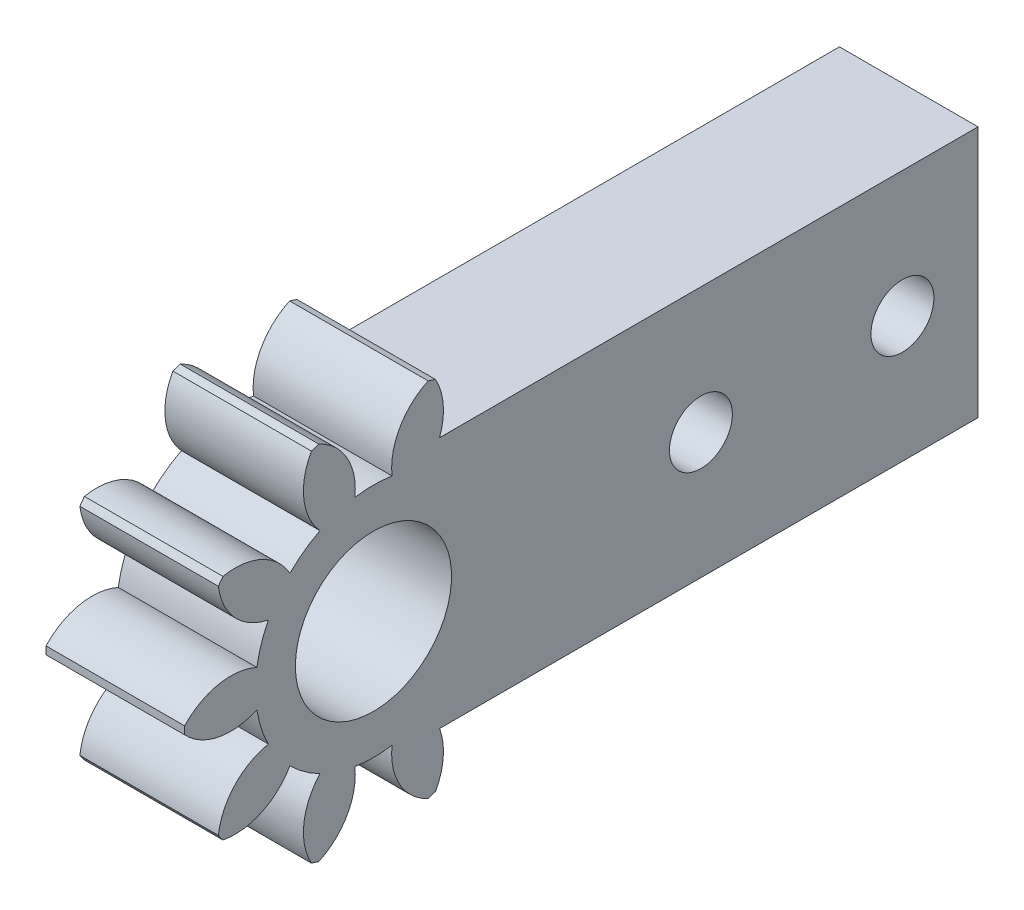
ISO-10303-21;
HEADER;
FILE_DESCRIPTION(('STEP AP214'),'2;1');
FILE_NAME('part.step','',(''),(''),'','','');
FILE_SCHEMA(('AUTOMOTIVE_DESIGN { 1 0 10303 214 1 1 1 1 }'));
ENDSEC;
DATA;
#1=APPLICATION_CONTEXT('core data for automotive mechanical design processes');
#2=APPLICATION_PROTOCOL_DEFINITION('international standard','automotive_design',2000,#1);
#3=PRODUCT_CONTEXT('',#1,'mechanical');
#4=PRODUCT('Part','Part','',(#3));
#5=PRODUCT_RELATED_PRODUCT_CATEGORY('part','',(#4));
#6=PRODUCT_DEFINITION_FORMATION('','',#4);
#7=PRODUCT_DEFINITION_CONTEXT('part definition',#1,'design');
#8=PRODUCT_DEFINITION('design','',#6,#7);
#9=PRODUCT_DEFINITION_SHAPE('','',#8);
#10=(LENGTH_UNIT() NAMED_UNIT(*) SI_UNIT(.MILLI.,.METRE.));
#11=(NAMED_UNIT(*) PLANE_ANGLE_UNIT() SI_UNIT($,.RADIAN.));
#12=(NAMED_UNIT(*) SI_UNIT($,.STERADIAN.) SOLID_ANGLE_UNIT());
#13=UNCERTAINTY_MEASURE_WITH_UNIT(LENGTH_MEASURE(1.E-05),#10,'distance_accuracy_value','');
#14=(GEOMETRIC_REPRESENTATION_CONTEXT(3) GLOBAL_UNCERTAINTY_ASSIGNED_CONTEXT((#13)) GLOBAL_UNIT_ASSIGNED_CONTEXT((#10,
#11,#12)) REPRESENTATION_CONTEXT('',''));
#15=CARTESIAN_POINT('',(0.,0.,0.));
#16=DIRECTION('',(0.,0.,1.));
#17=DIRECTION('',(1.,0.,0.));
#18=AXIS2_PLACEMENT_3D('',#15,#16,#17);
#19=CARTESIAN_POINT('',(5.5,-5.86640071722017,-0.279996722626007));
#20=DIRECTION('',(-1.,0.,0.));
#21=DIRECTION('',(0.,0.,1.));
#22=AXIS2_PLACEMENT_3D('',#19,#20,#21);
#23=CYLINDRICAL_SURFACE('',#22,2.5);
#24=CARTESIAN_POINT('',(0.,-5.86640071722017,-0.279996722626007));
#25=DIRECTION('',(-1.,0.,0.));
#26=DIRECTION('',(0.,-0.58778525229248,0.809016994374942));
#27=AXIS2_PLACEMENT_3D('',#24,#25,#26);
#28=CIRCLE('',#27,2.5);
#29=CARTESIAN_POINT('',(0.,-5.,-2.62506597473785));
#30=VERTEX_POINT('',#29);
#31=CARTESIAN_POINT('',(0.,-7.08385783572043,-2.46352555564219));
#32=VERTEX_POINT('',#31);
#33=EDGE_CURVE('E291',#30,#32,#28,.T.);
#34=ORIENTED_EDGE('',*,*,#33,.F.);
#35=DIRECTION('',(1.,0.,0.));
#36=VECTOR('',#35,1.);
#37=CARTESIAN_POINT('',(-24.0536940585425,-5.,-2.62506597473785));
#38=LINE('',#37,#36);
#39=CARTESIAN_POINT('',(5.5,-5.,-2.62506597473785));
#40=VERTEX_POINT('',#39);
#41=EDGE_CURVE('E259',#30,#40,#38,.T.);
#42=ORIENTED_EDGE('',*,*,#41,.T.);
#43=CARTESIAN_POINT('',(5.5,-5.86640071722017,-0.279996722626007));
#44=DIRECTION('',(-1.,0.,0.));
#45=DIRECTION('',(0.,-0.58778525229248,0.809016994374942));
#46=AXIS2_PLACEMENT_3D('',#43,#44,#45);
#47=CIRCLE('',#46,2.5);
#48=CARTESIAN_POINT('',(5.5,-7.08385783572044,-2.46352555564219));
#49=VERTEX_POINT('',#48);
#50=EDGE_CURVE('E295',#40,#49,#47,.T.);
#51=ORIENTED_EDGE('',*,*,#50,.T.);
#52=DIRECTION('',(-1.,0.,0.));
#53=VECTOR('',#52,1.);
#54=CARTESIAN_POINT('',(2.75,-7.08385783572044,-2.46352555564219));
#55=LINE('',#54,#53);
#56=EDGE_CURVE('E465',#49,#32,#55,.T.);
#57=ORIENTED_EDGE('',*,*,#56,.T.);
#58=EDGE_LOOP('',(#34,#42,#51,#57));
#59=FACE_BOUND('',#58,.T.);
#60=ADVANCED_FACE('F42',(#59),#23,.T.);
#61=CARTESIAN_POINT('',(5.5,0.,0.));
#62=DIRECTION('',(-1.,0.,0.));
#63=DIRECTION('',(0.,0.,1.));
#64=AXIS2_PLACEMENT_3D('',#61,#62,#63);
#65=PLANE('',#64);
#66=ORIENTED_EDGE('',*,*,#50,.F.);
#67=DIRECTION('',(0.,0.,1.));
#68=VECTOR('',#67,1.);
#69=CARTESIAN_POINT('',(5.5,-5.,0.));
#70=LINE('',#69,#68);
#71=CARTESIAN_POINT('',(5.5,-5.,-24.));
#72=VERTEX_POINT('',#71);
#73=EDGE_CURVE('E268',#72,#40,#70,.T.);
#74=ORIENTED_EDGE('',*,*,#73,.F.);
#75=DIRECTION('',(0.,1.,0.));
#76=VECTOR('',#75,1.);
#77=CARTESIAN_POINT('',(5.5,0.,-24.));
#78=LINE('',#77,#76);
#79=CARTESIAN_POINT('',(5.5,5.,-24.));
#80=VERTEX_POINT('',#79);
#81=EDGE_CURVE('E267',#72,#80,#78,.T.);
#82=ORIENTED_EDGE('',*,*,#81,.T.);
#83=DIRECTION('',(0.,0.,1.));
#84=VECTOR('',#83,1.);
#85=CARTESIAN_POINT('',(5.5,5.,0.));
#86=LINE('',#85,#84);
#87=CARTESIAN_POINT('',(5.5,5.,-2.62506597473772));
#88=VERTEX_POINT('',#87);
#89=EDGE_CURVE('E253',#80,#88,#86,.T.);
#90=ORIENTED_EDGE('',*,*,#89,.T.);
#91=CARTESIAN_POINT('',(5.5,5.86640071722017,-0.279996722625878));
#92=DIRECTION('',(-1.,0.,0.));
#93=DIRECTION('',(0.,-0.587785252292462,-0.809016994374955));
#94=AXIS2_PLACEMENT_3D('',#91,#92,#93);
#95=CIRCLE('',#94,2.5);
#96=CARTESIAN_POINT('',(5.5,7.08385783572049,-2.46352555564204));
#97=VERTEX_POINT('',#96);
#98=EDGE_CURVE('E296',#97,#88,#95,.T.);
#99=ORIENTED_EDGE('',*,*,#98,.F.);
#100=CARTESIAN_POINT('',(5.5,0.,0.));
#101=DIRECTION('',(-1.,0.,0.));
#102=DIRECTION('',(0.,0.,1.));
#103=AXIS2_PLACEMENT_3D('',#100,#101,#102);
#104=CIRCLE('',#103,7.5);
#105=CARTESIAN_POINT('',(5.5,7.17898536508605,-2.17075312458149));
#106=VERTEX_POINT('',#105);
#107=EDGE_CURVE('E332',#106,#97,#104,.T.);
#108=ORIENTED_EDGE('',*,*,#107,.F.);
#109=CARTESIAN_POINT('',(5.5,4.91059582029426,-3.22166171864632));
#110=DIRECTION('',(-1.,0.,0.));
#111=DIRECTION('',(0.,0.,-1.));
#112=AXIS2_PLACEMENT_3D('',#109,#110,#111);
#113=CIRCLE('',#112,2.5);
#114=CARTESIAN_POINT('',(5.5,4.6280790990235,-0.737676150612071));
#115=VERTEX_POINT('',#114);
#116=EDGE_CURVE('E392',#115,#106,#113,.T.);
#117=ORIENTED_EDGE('',*,*,#116,.F.);
#118=CARTESIAN_POINT('',(5.5,0.,0.));
#119=DIRECTION('',(-1.,0.,0.));
#120=DIRECTION('',(0.,0.,-1.));
#121=AXIS2_PLACEMENT_3D('',#118,#119,#120);
#122=CIRCLE('',#121,4.6865);
#123=CARTESIAN_POINT('',(5.5,4.6280790990235,0.73767615061207));
#124=VERTEX_POINT('',#123);
#125=EDGE_CURVE('E397',#124,#115,#122,.T.);
#126=ORIENTED_EDGE('',*,*,#125,.F.);
#127=CARTESIAN_POINT('',(5.5,4.91059582029426,3.22166171864632));
#128=DIRECTION('',(-1.,0.,0.));
#129=DIRECTION('',(0.,0.,-1.));
#130=AXIS2_PLACEMENT_3D('',#127,#128,#129);
#131=CIRCLE('',#130,2.5);
#132=CARTESIAN_POINT('',(5.5,7.17898536508605,2.17075312458149));
#133=VERTEX_POINT('',#132);
#134=EDGE_CURVE('E394',#133,#124,#131,.T.);
#135=ORIENTED_EDGE('',*,*,#134,.F.);
#136=CARTESIAN_POINT('',(5.5,7.08385783572045,2.46352555564214));
#137=VERTEX_POINT('',#136);
#138=EDGE_CURVE('E326',#137,#133,#104,.T.);
#139=ORIENTED_EDGE('',*,*,#138,.F.);
#140=CARTESIAN_POINT('',(5.5,5.86640071722017,0.279996722625963));
#141=DIRECTION('',(-1.,0.,0.));
#142=DIRECTION('',(0.,0.587785252292474,-0.809016994374947));
#143=AXIS2_PLACEMENT_3D('',#140,#141,#142);
#144=CIRCLE('',#143,2.5);
#145=CARTESIAN_POINT('',(5.5,4.17778980471916,2.1235240986588));
#146=VERTEX_POINT('',#145);
#147=EDGE_CURVE('E376',#146,#137,#144,.T.);
#148=ORIENTED_EDGE('',*,*,#147,.F.);
#149=CARTESIAN_POINT('',(5.5,0.,0.));
#150=DIRECTION('',(-1.,0.,0.));
#151=DIRECTION('',(0.,0.587785252292474,-0.809016994374947));
#152=AXIS2_PLACEMENT_3D('',#149,#150,#151);
#153=CIRCLE('',#152,4.6865);
#154=CARTESIAN_POINT('',(5.5,3.31059948012385,3.31710918303931));
#155=VERTEX_POINT('',#154);
#156=EDGE_CURVE('E384',#155,#146,#153,.T.);
#157=ORIENTED_EDGE('',*,*,#156,.F.);
#158=CARTESIAN_POINT('',(5.5,2.07911022502911,5.4927548836501));
#159=DIRECTION('',(-1.,0.,0.));
#160=DIRECTION('',(0.,0.587785252292474,-0.809016994374947));
#161=AXIS2_PLACEMENT_3D('',#158,#159,#160);
#162=CIRCLE('',#161,2.5);
#163=CARTESIAN_POINT('',(5.5,4.53198448972684,5.97587789240003));
#164=VERTEX_POINT('',#163);
#165=EDGE_CURVE('E471',#164,#155,#162,.T.);
#166=ORIENTED_EDGE('',*,*,#165,.F.);
#167=CARTESIAN_POINT('',(5.5,4.2829373845819,6.15682120576444));
#168=VERTEX_POINT('',#167);
#169=EDGE_CURVE('E493',#168,#164,#104,.T.);
#170=ORIENTED_EDGE('',*,*,#169,.F.);
#171=CARTESIAN_POINT('',(5.5,4.58143993179473,3.6747059325937));
#172=DIRECTION('',(-1.,0.,0.));
#173=DIRECTION('',(0.,0.951056516295155,-0.309016994374945));
#174=AXIS2_PLACEMENT_3D('',#171,#172,#173);
#175=CIRCLE('',#174,2.5);
#176=CARTESIAN_POINT('',(5.5,2.13172680286488,4.17361031817149));
#177=VERTEX_POINT('',#176);
#178=EDGE_CURVE('E421',#177,#168,#175,.T.);
#179=ORIENTED_EDGE('',*,*,#178,.F.);
#180=CARTESIAN_POINT('',(5.5,0.,0.));
#181=DIRECTION('',(-1.,0.,0.));
#182=DIRECTION('',(0.,0.951056516295155,-0.309016994374945));
#183=AXIS2_PLACEMENT_3D('',#180,#181,#182);
#184=CIRCLE('',#183,4.6865);
#185=CARTESIAN_POINT('',(5.5,0.728583382954609,4.62951925193993));
#186=VERTEX_POINT('',#185);
#187=EDGE_CURVE('E427',#186,#177,#184,.T.);
#188=ORIENTED_EDGE('',*,*,#187,.F.);
#189=CARTESIAN_POINT('',(5.5,-1.54652480983973,5.66580237497151));
#190=DIRECTION('',(-1.,0.,0.));
#191=DIRECTION('',(0.,0.951056516295155,-0.309016994374945));
#192=AXIS2_PLACEMENT_3D('',#189,#190,#191);
#193=CIRCLE('',#192,2.5);
#194=CARTESIAN_POINT('',(5.5,0.153919575779312,7.49842041794083));
#195=VERTEX_POINT('',#194);
#196=EDGE_CURVE('E526',#195,#186,#193,.T.);
#197=ORIENTED_EDGE('',*,*,#196,.F.);
#198=CARTESIAN_POINT('',(5.5,-0.153919575779365,7.49842041794083));
#199=VERTEX_POINT('',#198);
#200=EDGE_CURVE('E495',#199,#195,#104,.T.);
#201=ORIENTED_EDGE('',*,*,#200,.F.);
#202=CARTESIAN_POINT('',(5.5,1.54652480983969,5.66580237497152));
#203=DIRECTION('',(-1.,0.,0.));
#204=DIRECTION('',(0.,0.951056516295152,0.309016994374952));
#205=AXIS2_PLACEMENT_3D('',#202,#203,#204);
#206=CIRCLE('',#205,2.5);
#207=CARTESIAN_POINT('',(5.5,-0.728583382954642,4.62951925193992));
#208=VERTEX_POINT('',#207);
#209=EDGE_CURVE('E430',#208,#199,#206,.T.);
#210=ORIENTED_EDGE('',*,*,#209,.F.);
#211=CARTESIAN_POINT('',(5.5,0.,0.));
#212=DIRECTION('',(-1.,0.,0.));
#213=DIRECTION('',(0.,0.951056516295152,0.309016994374952));
#214=AXIS2_PLACEMENT_3D('',#211,#212,#213);
#215=CIRCLE('',#214,4.6865);
#216=CARTESIAN_POINT('',(5.5,-2.13172680286491,4.17361031817147));
#217=VERTEX_POINT('',#216);
#218=EDGE_CURVE('E435',#217,#208,#215,.T.);
#219=ORIENTED_EDGE('',*,*,#218,.F.);
#220=CARTESIAN_POINT('',(5.5,-4.58143993179475,3.67470593259367));
#221=DIRECTION('',(-1.,0.,0.));
#222=DIRECTION('',(0.,0.951056516295152,0.309016994374952));
#223=AXIS2_PLACEMENT_3D('',#220,#221,#222);
#224=CIRCLE('',#223,2.5);
#225=CARTESIAN_POINT('',(5.5,-4.28293738458195,6.15682120576441));
#226=VERTEX_POINT('',#225);
#227=EDGE_CURVE('E432',#226,#217,#224,.T.);
#228=ORIENTED_EDGE('',*,*,#227,.F.);
#229=CARTESIAN_POINT('',(5.5,-4.53198448972688,5.9758778924));
#230=VERTEX_POINT('',#229);
#231=EDGE_CURVE('E504',#230,#226,#104,.T.);
#232=ORIENTED_EDGE('',*,*,#231,.F.);
#233=CARTESIAN_POINT('',(5.5,-2.07911022502915,5.49275488365009));
#234=DIRECTION('',(-1.,0.,0.));
#235=DIRECTION('',(0.,0.587785252292469,0.809016994374951));
#236=AXIS2_PLACEMENT_3D('',#233,#234,#235);
#237=CIRCLE('',#236,2.5);
#238=CARTESIAN_POINT('',(5.5,-3.31059948012387,3.31710918303929));
#239=VERTEX_POINT('',#238);
#240=EDGE_CURVE('E543',#239,#230,#237,.T.);
#241=ORIENTED_EDGE('',*,*,#240,.F.);
#242=CARTESIAN_POINT('',(5.5,0.,0.));
#243=DIRECTION('',(-1.,0.,0.));
#244=DIRECTION('',(0.,0.587785252292469,0.809016994374951));
#245=AXIS2_PLACEMENT_3D('',#242,#243,#244);
#246=CIRCLE('',#245,4.6865);
#247=CARTESIAN_POINT('',(5.5,-4.17778980471917,2.12352409865877));
#248=VERTEX_POINT('',#247);
#249=EDGE_CURVE('E537',#248,#239,#246,.T.);
#250=ORIENTED_EDGE('',*,*,#249,.F.);
#251=CARTESIAN_POINT('',(5.5,-5.86640071722017,0.279996722625922));
#252=DIRECTION('',(-1.,0.,0.));
#253=DIRECTION('',(0.,0.587785252292469,0.809016994374951));
#254=AXIS2_PLACEMENT_3D('',#251,#252,#253);
#255=CIRCLE('',#254,2.5);
#256=CARTESIAN_POINT('',(5.5,-7.08385783572047,2.46352555564209));
#257=VERTEX_POINT('',#256);
#258=EDGE_CURVE('E551',#257,#248,#255,.T.);
#259=ORIENTED_EDGE('',*,*,#258,.F.);
#260=CARTESIAN_POINT('',(5.5,-7.17898536508606,2.17075312458144));
#261=VERTEX_POINT('',#260);
#262=EDGE_CURVE('E498',#261,#257,#104,.T.);
#263=ORIENTED_EDGE('',*,*,#262,.F.);
#264=CARTESIAN_POINT('',(5.5,-4.91059582029428,3.22166171864628));
#265=DIRECTION('',(-1.,0.,0.));
#266=DIRECTION('',(0.,0.,1.));
#267=AXIS2_PLACEMENT_3D('',#264,#265,#266);
#268=CIRCLE('',#267,2.5);
#269=CARTESIAN_POINT('',(5.5,-4.6280790990235,0.737676150612039));
#270=VERTEX_POINT('',#269);
#271=EDGE_CURVE('E299',#270,#261,#268,.T.);
#272=ORIENTED_EDGE('',*,*,#271,.F.);
#273=CARTESIAN_POINT('',(5.5,0.,0.));
#274=DIRECTION('',(-1.,0.,0.));
#275=DIRECTION('',(0.,0.,1.));
#276=AXIS2_PLACEMENT_3D('',#273,#274,#275);
#277=CIRCLE('',#276,4.6865);
#278=CARTESIAN_POINT('',(5.5,-4.62807909902349,-0.737676150612103));
#279=VERTEX_POINT('',#278);
#280=EDGE_CURVE('E304',#279,#270,#277,.T.);
#281=ORIENTED_EDGE('',*,*,#280,.F.);
#282=CARTESIAN_POINT('',(5.5,-4.91059582029424,-3.22166171864635));
#283=DIRECTION('',(-1.,0.,0.));
#284=DIRECTION('',(0.,0.,1.));
#285=AXIS2_PLACEMENT_3D('',#282,#283,#284);
#286=CIRCLE('',#285,2.5);
#287=CARTESIAN_POINT('',(5.5,-7.17898536508604,-2.17075312458154));
#288=VERTEX_POINT('',#287);
#289=EDGE_CURVE('E301',#288,#279,#286,.T.);
#290=ORIENTED_EDGE('',*,*,#289,.F.);
#291=EDGE_CURVE('E494',#49,#288,#104,.T.);
#292=ORIENTED_EDGE('',*,*,#291,.F.);
#293=EDGE_LOOP('',(#66,#74,#82,#90,#99,#108,#117,#126,#135,#139,#148,#157,#166,#170,#179,#188,
#197,#201,#210,#219,#228,#232,#241,#250,#259,#263,#272,#281,#290,#292));
#294=FACE_BOUND('',#293,.T.);
#295=CARTESIAN_POINT('',(5.5,0.,0.));
#296=DIRECTION('',(-1.,0.,0.));
#297=DIRECTION('',(0.,0.,1.));
#298=AXIS2_PLACEMENT_3D('',#295,#296,#297);
#299=CIRCLE('',#298,3.1);
#300=CARTESIAN_POINT('',(5.5,0.,3.1));
#301=VERTEX_POINT('',#300);
#302=EDGE_CURVE('E283',#301,#301,#299,.F.);
#303=ORIENTED_EDGE('',*,*,#302,.F.);
#304=EDGE_LOOP('',(#303));
#305=FACE_BOUND('',#304,.T.);
#306=CARTESIAN_POINT('',(5.5,0.,-21.));
#307=DIRECTION('',(1.,0.,0.));
#308=DIRECTION('',(0.,0.,-1.));
#309=AXIS2_PLACEMENT_3D('',#306,#307,#308);
#310=CIRCLE('',#309,1.25);
#311=CARTESIAN_POINT('',(5.5,0.,-22.25));
#312=VERTEX_POINT('',#311);
#313=EDGE_CURVE('E279',#312,#312,#310,.T.);
#314=ORIENTED_EDGE('',*,*,#313,.F.);
#315=EDGE_LOOP('',(#314));
#316=FACE_BOUND('',#315,.T.);
#317=CARTESIAN_POINT('',(5.5,0.,-13.));
#318=DIRECTION('',(1.,0.,0.));
#319=DIRECTION('',(0.,0.,-1.));
#320=AXIS2_PLACEMENT_3D('',#317,#318,#319);
#321=CIRCLE('',#320,1.25);
#322=CARTESIAN_POINT('',(5.5,0.,-14.25));
#323=VERTEX_POINT('',#322);
#324=EDGE_CURVE('E594',#323,#323,#321,.T.);
#325=ORIENTED_EDGE('',*,*,#324,.F.);
#326=EDGE_LOOP('',(#325));
#327=FACE_BOUND('',#326,.T.);
#328=ADVANCED_FACE('F44',(#294,#305,#316,#327),#65,.F.);
#329=CARTESIAN_POINT('',(-10.,0.,0.));
#330=DIRECTION('',(-1.,0.,0.));
#331=DIRECTION('',(0.,0.,1.));
#332=AXIS2_PLACEMENT_3D('',#329,#330,#331);
#333=CYLINDRICAL_SURFACE('',#332,7.5);
#334=DIRECTION('',(-1.,0.,0.));
#335=VECTOR('',#334,1.);
#336=CARTESIAN_POINT('',(2.75,7.08385783572049,-2.46352555564204));
#337=LINE('',#336,#335);
#338=CARTESIAN_POINT('',(0.,7.08385783572049,-2.46352555564204));
#339=VERTEX_POINT('',#338);
#340=EDGE_CURVE('E468',#339,#97,#337,.F.);
#341=ORIENTED_EDGE('',*,*,#340,.F.);
#342=CARTESIAN_POINT('',(0.,0.,0.));
#343=DIRECTION('',(-1.,0.,0.));
#344=DIRECTION('',(0.,0.,1.));
#345=AXIS2_PLACEMENT_3D('',#342,#343,#344);
#346=CIRCLE('',#345,7.5);
#347=CARTESIAN_POINT('',(0.,7.17898536508605,-2.17075312458149));
#348=VERTEX_POINT('',#347);
#349=EDGE_CURVE('E320',#348,#339,#346,.T.);
#350=ORIENTED_EDGE('',*,*,#349,.F.);
#351=DIRECTION('',(-1.,0.,0.));
#352=VECTOR('',#351,1.);
#353=CARTESIAN_POINT('',(2.75,7.17898536508605,-2.17075312458149));
#354=LINE('',#353,#352);
#355=EDGE_CURVE('E330',#106,#348,#354,.T.);
#356=ORIENTED_EDGE('',*,*,#355,.F.);
#357=ORIENTED_EDGE('',*,*,#107,.T.);
#358=EDGE_LOOP('',(#341,#350,#356,#357));
#359=FACE_BOUND('',#358,.T.);
#360=ADVANCED_FACE('F616',(#359),#333,.T.);
#361=ORIENTED_EDGE('',*,*,#56,.F.);
#362=ORIENTED_EDGE('',*,*,#291,.T.);
#363=DIRECTION('',(-1.,0.,0.));
#364=VECTOR('',#363,1.);
#365=CARTESIAN_POINT('',(2.75,-7.17898536508604,-2.17075312458154));
#366=LINE('',#365,#364);
#367=CARTESIAN_POINT('',(0.,-7.17898536508603,-2.17075312458154));
#368=VERTEX_POINT('',#367);
#369=EDGE_CURVE('E453',#368,#288,#366,.F.);
#370=ORIENTED_EDGE('',*,*,#369,.F.);
#371=EDGE_CURVE('E327',#32,#368,#346,.T.);
#372=ORIENTED_EDGE('',*,*,#371,.F.);
#373=EDGE_LOOP('',(#361,#362,#370,#372));
#374=FACE_BOUND('',#373,.T.);
#375=ADVANCED_FACE('F733',(#374),#333,.T.);
#376=DIRECTION('',(-1.,0.,0.));
#377=VECTOR('',#376,1.);
#378=CARTESIAN_POINT('',(2.75,4.2829373845819,6.15682120576444));
#379=LINE('',#378,#377);
#380=CARTESIAN_POINT('',(0.,4.2829373845819,6.15682120576444));
#381=VERTEX_POINT('',#380);
#382=EDGE_CURVE('E463',#168,#381,#379,.T.);
#383=ORIENTED_EDGE('',*,*,#382,.F.);
#384=ORIENTED_EDGE('',*,*,#169,.T.);
#385=DIRECTION('',(-1.,0.,0.));
#386=VECTOR('',#385,1.);
#387=CARTESIAN_POINT('',(2.75,4.53198448972684,5.97587789240003));
#388=LINE('',#387,#386);
#389=CARTESIAN_POINT('',(0.,4.53198448972684,5.97587789240002));
#390=VERTEX_POINT('',#389);
#391=EDGE_CURVE('E386',#390,#164,#388,.F.);
#392=ORIENTED_EDGE('',*,*,#391,.F.);
#393=EDGE_CURVE('E328',#381,#390,#346,.T.);
#394=ORIENTED_EDGE('',*,*,#393,.F.);
#395=EDGE_LOOP('',(#383,#384,#392,#394));
#396=FACE_BOUND('',#395,.T.);
#397=ADVANCED_FACE('F642',(#396),#333,.T.);
#398=DIRECTION('',(-1.,0.,0.));
#399=VECTOR('',#398,1.);
#400=CARTESIAN_POINT('',(2.75,0.153919575779311,7.49842041794083));
#401=LINE('',#400,#399);
#402=CARTESIAN_POINT('',(0.,0.153919575779314,7.49842041794083));
#403=VERTEX_POINT('',#402);
#404=EDGE_CURVE('E461',#403,#195,#401,.F.);
#405=ORIENTED_EDGE('',*,*,#404,.F.);
#406=CARTESIAN_POINT('',(0.,-0.153919575779368,7.49842041794082));
#407=VERTEX_POINT('',#406);
#408=EDGE_CURVE('E579',#407,#403,#346,.T.);
#409=ORIENTED_EDGE('',*,*,#408,.F.);
#410=DIRECTION('',(-1.,0.,0.));
#411=VECTOR('',#410,1.);
#412=CARTESIAN_POINT('',(2.75,-0.153919575779365,7.49842041794083));
#413=LINE('',#412,#411);
#414=EDGE_CURVE('E459',#199,#407,#413,.T.);
#415=ORIENTED_EDGE('',*,*,#414,.F.);
#416=ORIENTED_EDGE('',*,*,#200,.T.);
#417=EDGE_LOOP('',(#405,#409,#415,#416));
#418=FACE_BOUND('',#417,.T.);
#419=ADVANCED_FACE('F519',(#418),#333,.T.);
#420=DIRECTION('',(-1.,0.,0.));
#421=VECTOR('',#420,1.);
#422=CARTESIAN_POINT('',(2.75,-4.28293738458195,6.15682120576441));
#423=LINE('',#422,#421);
#424=CARTESIAN_POINT('',(0.,-4.28293738458194,6.15682120576441));
#425=VERTEX_POINT('',#424);
#426=EDGE_CURVE('E457',#425,#226,#423,.F.);
#427=ORIENTED_EDGE('',*,*,#426,.F.);
#428=CARTESIAN_POINT('',(0.,-4.53198448972688,5.97587789239999));
#429=VERTEX_POINT('',#428);
#430=EDGE_CURVE('E575',#429,#425,#346,.T.);
#431=ORIENTED_EDGE('',*,*,#430,.F.);
#432=DIRECTION('',(-1.,0.,0.));
#433=VECTOR('',#432,1.);
#434=CARTESIAN_POINT('',(2.75,-4.53198448972688,5.9758778924));
#435=LINE('',#434,#433);
#436=EDGE_CURVE('E451',#230,#429,#435,.T.);
#437=ORIENTED_EDGE('',*,*,#436,.F.);
#438=ORIENTED_EDGE('',*,*,#231,.T.);
#439=EDGE_LOOP('',(#427,#431,#437,#438));
#440=FACE_BOUND('',#439,.T.);
#441=ADVANCED_FACE('F702',(#440),#333,.T.);
#442=DIRECTION('',(-1.,0.,0.));
#443=VECTOR('',#442,1.);
#444=CARTESIAN_POINT('',(2.75,-7.17898536508606,2.17075312458144));
#445=LINE('',#444,#443);
#446=CARTESIAN_POINT('',(0.,-7.17898536508606,2.17075312458144));
#447=VERTEX_POINT('',#446);
#448=EDGE_CURVE('E455',#261,#447,#445,.T.);
#449=ORIENTED_EDGE('',*,*,#448,.F.);
#450=ORIENTED_EDGE('',*,*,#262,.T.);
#451=DIRECTION('',(-1.,0.,0.));
#452=VECTOR('',#451,1.);
#453=CARTESIAN_POINT('',(2.75,-7.08385783572047,2.46352555564209));
#454=LINE('',#453,#452);
#455=CARTESIAN_POINT('',(0.,-7.08385783572047,2.46352555564209));
#456=VERTEX_POINT('',#455);
#457=EDGE_CURVE('E429',#456,#257,#454,.F.);
#458=ORIENTED_EDGE('',*,*,#457,.F.);
#459=EDGE_CURVE('E573',#447,#456,#346,.T.);
#460=ORIENTED_EDGE('',*,*,#459,.F.);
#461=EDGE_LOOP('',(#449,#450,#458,#460));
#462=FACE_BOUND('',#461,.T.);
#463=ADVANCED_FACE('F728',(#462),#333,.T.);
#464=CARTESIAN_POINT('',(0.,0.,0.));
#465=DIRECTION('',(1.,0.,0.));
#466=DIRECTION('',(0.,0.,-1.));
#467=AXIS2_PLACEMENT_3D('',#464,#465,#466);
#468=PLANE('',#467);
#469=DIRECTION('',(0.,0.,-1.));
#470=VECTOR('',#469,1.);
#471=CARTESIAN_POINT('',(0.,-5.,0.));
#472=LINE('',#471,#470);
#473=CARTESIAN_POINT('',(0.,-5.,-24.));
#474=VERTEX_POINT('',#473);
#475=EDGE_CURVE('E245',#30,#474,#472,.T.);
#476=ORIENTED_EDGE('',*,*,#475,.F.);
#477=ORIENTED_EDGE('',*,*,#33,.T.);
#478=ORIENTED_EDGE('',*,*,#371,.T.);
#479=CARTESIAN_POINT('',(0.,-4.91059582029424,-3.22166171864635));
#480=DIRECTION('',(1.,0.,0.));
#481=DIRECTION('',(0.,0.,-1.));
#482=AXIS2_PLACEMENT_3D('',#479,#480,#481);
#483=CIRCLE('',#482,2.5);
#484=CARTESIAN_POINT('',(0.,-4.62807909902349,-0.737676150612103));
#485=VERTEX_POINT('',#484);
#486=EDGE_CURVE('E568',#485,#368,#483,.T.);
#487=ORIENTED_EDGE('',*,*,#486,.F.);
#488=CARTESIAN_POINT('',(0.,0.,0.));
#489=DIRECTION('',(-1.,0.,0.));
#490=DIRECTION('',(0.,0.,1.));
#491=AXIS2_PLACEMENT_3D('',#488,#489,#490);
#492=CIRCLE('',#491,4.6865);
#493=CARTESIAN_POINT('',(0.,-4.6280790990235,0.737676150612039));
#494=VERTEX_POINT('',#493);
#495=EDGE_CURVE('E302',#485,#494,#492,.T.);
#496=ORIENTED_EDGE('',*,*,#495,.T.);
#497=CARTESIAN_POINT('',(0.,-4.91059582029428,3.22166171864628));
#498=DIRECTION('',(-1.,0.,0.));
#499=DIRECTION('',(0.,0.,1.));
#500=AXIS2_PLACEMENT_3D('',#497,#498,#499);
#501=CIRCLE('',#500,2.5);
#502=EDGE_CURVE('E307',#494,#447,#501,.T.);
#503=ORIENTED_EDGE('',*,*,#502,.T.);
#504=ORIENTED_EDGE('',*,*,#459,.T.);
#505=CARTESIAN_POINT('',(0.,-5.86640071722017,0.279996722625922));
#506=DIRECTION('',(1.,0.,0.));
#507=DIRECTION('',(0.,0.,-1.));
#508=AXIS2_PLACEMENT_3D('',#505,#506,#507);
#509=CIRCLE('',#508,2.5);
#510=CARTESIAN_POINT('',(0.,-4.17778980471917,2.12352409865877));
#511=VERTEX_POINT('',#510);
#512=EDGE_CURVE('E367',#511,#456,#509,.T.);
#513=ORIENTED_EDGE('',*,*,#512,.F.);
#514=CARTESIAN_POINT('',(0.,0.,0.));
#515=DIRECTION('',(-1.,0.,0.));
#516=DIRECTION('',(0.,0.587785252292469,0.809016994374951));
#517=AXIS2_PLACEMENT_3D('',#514,#515,#516);
#518=CIRCLE('',#517,4.6865);
#519=CARTESIAN_POINT('',(0.,-3.31059948012387,3.31710918303929));
#520=VERTEX_POINT('',#519);
#521=EDGE_CURVE('E538',#511,#520,#518,.T.);
#522=ORIENTED_EDGE('',*,*,#521,.T.);
#523=CARTESIAN_POINT('',(0.,-2.07911022502915,5.49275488365009));
#524=DIRECTION('',(-1.,0.,0.));
#525=DIRECTION('',(0.,0.587785252292469,0.809016994374951));
#526=AXIS2_PLACEMENT_3D('',#523,#524,#525);
#527=CIRCLE('',#526,2.5);
#528=EDGE_CURVE('E544',#520,#429,#527,.T.);
#529=ORIENTED_EDGE('',*,*,#528,.T.);
#530=ORIENTED_EDGE('',*,*,#430,.T.);
#531=CARTESIAN_POINT('',(0.,-4.58143993179475,3.67470593259367));
#532=DIRECTION('',(1.,0.,0.));
#533=DIRECTION('',(0.,0.,-1.));
#534=AXIS2_PLACEMENT_3D('',#531,#532,#533);
#535=CIRCLE('',#534,2.5);
#536=CARTESIAN_POINT('',(0.,-2.13172680286491,4.17361031817147));
#537=VERTEX_POINT('',#536);
#538=EDGE_CURVE('E411',#537,#425,#535,.T.);
#539=ORIENTED_EDGE('',*,*,#538,.F.);
#540=CARTESIAN_POINT('',(0.,0.,0.));
#541=DIRECTION('',(-1.,0.,0.));
#542=DIRECTION('',(0.,0.951056516295152,0.309016994374952));
#543=AXIS2_PLACEMENT_3D('',#540,#541,#542);
#544=CIRCLE('',#543,4.6865);
#545=CARTESIAN_POINT('',(0.,-0.728583382954641,4.62951925193992));
#546=VERTEX_POINT('',#545);
#547=EDGE_CURVE('E433',#537,#546,#544,.T.);
#548=ORIENTED_EDGE('',*,*,#547,.T.);
#549=CARTESIAN_POINT('',(0.,1.54652480983969,5.66580237497152));
#550=DIRECTION('',(-1.,0.,0.));
#551=DIRECTION('',(0.,0.951056516295152,0.309016994374952));
#552=AXIS2_PLACEMENT_3D('',#549,#550,#551);
#553=CIRCLE('',#552,2.5);
#554=EDGE_CURVE('E67',#546,#407,#553,.T.);
#555=ORIENTED_EDGE('',*,*,#554,.T.);
#556=ORIENTED_EDGE('',*,*,#408,.T.);
#557=CARTESIAN_POINT('',(0.,-1.54652480983973,5.66580237497151));
#558=DIRECTION('',(1.,0.,0.));
#559=DIRECTION('',(0.,0.,-1.));
#560=AXIS2_PLACEMENT_3D('',#557,#558,#559);
#561=CIRCLE('',#560,2.5);
#562=CARTESIAN_POINT('',(0.,0.728583382954609,4.62951925193993));
#563=VERTEX_POINT('',#562);
#564=EDGE_CURVE('E52',#563,#403,#561,.T.);
#565=ORIENTED_EDGE('',*,*,#564,.F.);
#566=CARTESIAN_POINT('',(0.,0.,0.));
#567=DIRECTION('',(-1.,0.,0.));
#568=DIRECTION('',(0.,0.951056516295155,-0.309016994374945));
#569=AXIS2_PLACEMENT_3D('',#566,#567,#568);
#570=CIRCLE('',#569,4.6865);
#571=CARTESIAN_POINT('',(0.,2.13172680286488,4.17361031817149));
#572=VERTEX_POINT('',#571);
#573=EDGE_CURVE('E416',#563,#572,#570,.T.);
#574=ORIENTED_EDGE('',*,*,#573,.T.);
#575=CARTESIAN_POINT('',(0.,4.58143993179473,3.6747059325937));
#576=DIRECTION('',(-1.,0.,0.));
#577=DIRECTION('',(0.,0.951056516295155,-0.309016994374945));
#578=AXIS2_PLACEMENT_3D('',#575,#576,#577);
#579=CIRCLE('',#578,2.5);
#580=EDGE_CURVE('E59',#572,#381,#579,.T.);
#581=ORIENTED_EDGE('',*,*,#580,.T.);
#582=ORIENTED_EDGE('',*,*,#393,.T.);
#583=CARTESIAN_POINT('',(0.,2.07911022502911,5.4927548836501));
#584=DIRECTION('',(1.,0.,0.));
#585=DIRECTION('',(0.,0.,-1.));
#586=AXIS2_PLACEMENT_3D('',#583,#584,#585);
#587=CIRCLE('',#586,2.5);
#588=CARTESIAN_POINT('',(0.,3.31059948012385,3.31710918303931));
#589=VERTEX_POINT('',#588);
#590=EDGE_CURVE('E363',#589,#390,#587,.T.);
#591=ORIENTED_EDGE('',*,*,#590,.F.);
#592=CARTESIAN_POINT('',(0.,0.,0.));
#593=DIRECTION('',(-1.,0.,0.));
#594=DIRECTION('',(0.,0.587785252292474,-0.809016994374947));
#595=AXIS2_PLACEMENT_3D('',#592,#593,#594);
#596=CIRCLE('',#595,4.6865);
#597=CARTESIAN_POINT('',(0.,4.17778980471916,2.1235240986588));
#598=VERTEX_POINT('',#597);
#599=EDGE_CURVE('E371',#589,#598,#596,.T.);
#600=ORIENTED_EDGE('',*,*,#599,.T.);
#601=CARTESIAN_POINT('',(0.,5.86640071722017,0.279996722625963));
#602=DIRECTION('',(-1.,0.,0.));
#603=DIRECTION('',(0.,0.587785252292474,-0.809016994374947));
#604=AXIS2_PLACEMENT_3D('',#601,#602,#603);
#605=CIRCLE('',#604,2.5);
#606=CARTESIAN_POINT('',(0.,7.08385783572045,2.46352555564214));
#607=VERTEX_POINT('',#606);
#608=EDGE_CURVE('E377',#598,#607,#605,.T.);
#609=ORIENTED_EDGE('',*,*,#608,.T.);
#610=CARTESIAN_POINT('',(0.,7.17898536508605,2.17075312458149));
#611=VERTEX_POINT('',#610);
#612=EDGE_CURVE('E329',#607,#611,#346,.T.);
#613=ORIENTED_EDGE('',*,*,#612,.T.);
#614=CARTESIAN_POINT('',(0.,4.91059582029426,3.22166171864632));
#615=DIRECTION('',(1.,0.,0.));
#616=DIRECTION('',(0.,0.,-1.));
#617=AXIS2_PLACEMENT_3D('',#614,#615,#616);
#618=CIRCLE('',#617,2.5);
#619=CARTESIAN_POINT('',(0.,4.6280790990235,0.73767615061207));
#620=VERTEX_POINT('',#619);
#621=EDGE_CURVE('E358',#620,#611,#618,.T.);
#622=ORIENTED_EDGE('',*,*,#621,.F.);
#623=CARTESIAN_POINT('',(0.,0.,0.));
#624=DIRECTION('',(-1.,0.,0.));
#625=DIRECTION('',(0.,0.,-1.));
#626=AXIS2_PLACEMENT_3D('',#623,#624,#625);
#627=CIRCLE('',#626,4.6865);
#628=CARTESIAN_POINT('',(0.,4.6280790990235,-0.737676150612071));
#629=VERTEX_POINT('',#628);
#630=EDGE_CURVE('E395',#620,#629,#627,.T.);
#631=ORIENTED_EDGE('',*,*,#630,.T.);
#632=CARTESIAN_POINT('',(0.,4.91059582029426,-3.22166171864632));
#633=DIRECTION('',(-1.,0.,0.));
#634=DIRECTION('',(0.,0.,-1.));
#635=AXIS2_PLACEMENT_3D('',#632,#633,#634);
#636=CIRCLE('',#635,2.5);
#637=EDGE_CURVE('E391',#629,#348,#636,.T.);
#638=ORIENTED_EDGE('',*,*,#637,.T.);
#639=ORIENTED_EDGE('',*,*,#349,.T.);
#640=CARTESIAN_POINT('',(0.,5.86640071722017,-0.279996722625878));
#641=DIRECTION('',(1.,0.,0.));
#642=DIRECTION('',(0.,0.,-1.));
#643=AXIS2_PLACEMENT_3D('',#640,#641,#642);
#644=CIRCLE('',#643,2.5);
#645=CARTESIAN_POINT('',(0.,5.,-2.62506597473772));
#646=VERTEX_POINT('',#645);
#647=EDGE_CURVE('E12',#646,#339,#644,.T.);
#648=ORIENTED_EDGE('',*,*,#647,.F.);
#649=DIRECTION('',(0.,0.,-1.));
#650=VECTOR('',#649,1.);
#651=CARTESIAN_POINT('',(0.,5.,0.));
#652=LINE('',#651,#650);
#653=CARTESIAN_POINT('',(0.,5.,-24.));
#654=VERTEX_POINT('',#653);
#655=EDGE_CURVE('E248',#646,#654,#652,.T.);
#656=ORIENTED_EDGE('',*,*,#655,.T.);
#657=DIRECTION('',(0.,-1.,0.));
#658=VECTOR('',#657,1.);
#659=CARTESIAN_POINT('',(0.,0.,-24.));
#660=LINE('',#659,#658);
#661=EDGE_CURVE('E241',#654,#474,#660,.T.);
#662=ORIENTED_EDGE('',*,*,#661,.T.);
#663=EDGE_LOOP('',(#476,#477,#478,#487,#496,#503,#504,#513,#522,#529,#530,#539,#548,#555,#556,
#565,#574,#581,#582,#591,#600,#609,#613,#622,#631,#638,#639,#648,#656,#662));
#664=FACE_BOUND('',#663,.T.);
#665=CARTESIAN_POINT('',(0.,0.,0.));
#666=DIRECTION('',(1.,0.,0.));
#667=DIRECTION('',(0.,0.,-1.));
#668=AXIS2_PLACEMENT_3D('',#665,#666,#667);
#669=CIRCLE('',#668,3.1);
#670=CARTESIAN_POINT('',(0.,0.,-3.1));
#671=VERTEX_POINT('',#670);
#672=EDGE_CURVE('E46',#671,#671,#669,.F.);
#673=ORIENTED_EDGE('',*,*,#672,.F.);
#674=EDGE_LOOP('',(#673));
#675=FACE_BOUND('',#674,.T.);
#676=CARTESIAN_POINT('',(0.,0.,-21.));
#677=DIRECTION('',(1.,0.,0.));
#678=DIRECTION('',(0.,0.,-1.));
#679=AXIS2_PLACEMENT_3D('',#676,#677,#678);
#680=CIRCLE('',#679,1.25);
#681=CARTESIAN_POINT('',(0.,0.,-22.25));
#682=VERTEX_POINT('',#681);
#683=EDGE_CURVE('E591',#682,#682,#680,.F.);
#684=ORIENTED_EDGE('',*,*,#683,.F.);
#685=EDGE_LOOP('',(#684));
#686=FACE_BOUND('',#685,.T.);
#687=CARTESIAN_POINT('',(0.,0.,-13.));
#688=DIRECTION('',(1.,0.,0.));
#689=DIRECTION('',(0.,0.,-1.));
#690=AXIS2_PLACEMENT_3D('',#687,#688,#689);
#691=CIRCLE('',#690,1.25);
#692=CARTESIAN_POINT('',(0.,0.,-14.25));
#693=VERTEX_POINT('',#692);
#694=EDGE_CURVE('E276',#693,#693,#691,.F.);
#695=ORIENTED_EDGE('',*,*,#694,.F.);
#696=EDGE_LOOP('',(#695));
#697=FACE_BOUND('',#696,.T.);
#698=ADVANCED_FACE('F243',(#664,#675,#686,#697),#468,.F.);
#699=DIRECTION('',(-1.,0.,0.));
#700=VECTOR('',#699,1.);
#701=CARTESIAN_POINT('',(2.75,7.08385783572045,2.46352555564214));
#702=LINE('',#701,#700);
#703=EDGE_CURVE('E389',#137,#607,#702,.T.);
#704=ORIENTED_EDGE('',*,*,#703,.F.);
#705=ORIENTED_EDGE('',*,*,#138,.T.);
#706=DIRECTION('',(-1.,0.,0.));
#707=VECTOR('',#706,1.);
#708=CARTESIAN_POINT('',(2.75,7.17898536508605,2.17075312458149));
#709=LINE('',#708,#707);
#710=EDGE_CURVE('E629',#611,#133,#709,.F.);
#711=ORIENTED_EDGE('',*,*,#710,.F.);
#712=ORIENTED_EDGE('',*,*,#612,.F.);
#713=EDGE_LOOP('',(#704,#705,#711,#712));
#714=FACE_BOUND('',#713,.T.);
#715=ADVANCED_FACE('F634',(#714),#333,.T.);
#716=CARTESIAN_POINT('',(5.5,4.91059582029426,-3.22166171864632));
#717=DIRECTION('',(-1.,0.,0.));
#718=DIRECTION('',(0.,0.,1.));
#719=AXIS2_PLACEMENT_3D('',#716,#717,#718);
#720=CYLINDRICAL_SURFACE('',#719,2.5);
#721=ORIENTED_EDGE('',*,*,#355,.T.);
#722=ORIENTED_EDGE('',*,*,#637,.F.);
#723=DIRECTION('',(-1.,0.,0.));
#724=VECTOR('',#723,1.);
#725=CARTESIAN_POINT('',(5.5,4.6280790990235,-0.737676150612071));
#726=LINE('',#725,#724);
#727=EDGE_CURVE('E399',#115,#629,#726,.T.);
#728=ORIENTED_EDGE('',*,*,#727,.F.);
#729=ORIENTED_EDGE('',*,*,#116,.T.);
#730=EDGE_LOOP('',(#721,#722,#728,#729));
#731=FACE_BOUND('',#730,.T.);
#732=ADVANCED_FACE('F623',(#731),#720,.T.);
#733=CARTESIAN_POINT('',(5.5,4.91059582029426,3.22166171864632));
#734=DIRECTION('',(-1.,0.,0.));
#735=DIRECTION('',(0.,0.,1.));
#736=AXIS2_PLACEMENT_3D('',#733,#734,#735);
#737=CYLINDRICAL_SURFACE('',#736,2.5);
#738=ORIENTED_EDGE('',*,*,#710,.T.);
#739=ORIENTED_EDGE('',*,*,#134,.T.);
#740=DIRECTION('',(-1.,0.,0.));
#741=VECTOR('',#740,1.);
#742=CARTESIAN_POINT('',(5.5,4.6280790990235,0.73767615061207));
#743=LINE('',#742,#741);
#744=EDGE_CURVE('E628',#124,#620,#743,.T.);
#745=ORIENTED_EDGE('',*,*,#744,.T.);
#746=ORIENTED_EDGE('',*,*,#621,.T.);
#747=EDGE_LOOP('',(#738,#739,#745,#746));
#748=FACE_BOUND('',#747,.T.);
#749=ADVANCED_FACE('F632',(#748),#737,.T.);
#750=CARTESIAN_POINT('',(5.5,0.,0.));
#751=DIRECTION('',(-1.,0.,0.));
#752=DIRECTION('',(0.,0.,1.));
#753=AXIS2_PLACEMENT_3D('',#750,#751,#752);
#754=CYLINDRICAL_SURFACE('',#753,4.6865);
#755=ORIENTED_EDGE('',*,*,#630,.F.);
#756=ORIENTED_EDGE('',*,*,#744,.F.);
#757=ORIENTED_EDGE('',*,*,#125,.T.);
#758=ORIENTED_EDGE('',*,*,#727,.T.);
#759=EDGE_LOOP('',(#755,#756,#757,#758));
#760=FACE_BOUND('',#759,.T.);
#761=ADVANCED_FACE('F626',(#760),#754,.T.);
#762=CARTESIAN_POINT('',(5.5,5.86640071722017,0.279996722625963));
#763=DIRECTION('',(-1.,0.,0.));
#764=DIRECTION('',(0.,0.,1.));
#765=AXIS2_PLACEMENT_3D('',#762,#763,#764);
#766=CYLINDRICAL_SURFACE('',#765,2.5);
#767=ORIENTED_EDGE('',*,*,#703,.T.);
#768=ORIENTED_EDGE('',*,*,#608,.F.);
#769=DIRECTION('',(-1.,0.,0.));
#770=VECTOR('',#769,1.);
#771=CARTESIAN_POINT('',(5.5,4.17778980471916,2.1235240986588));
#772=LINE('',#771,#770);
#773=EDGE_CURVE('E380',#146,#598,#772,.T.);
#774=ORIENTED_EDGE('',*,*,#773,.F.);
#775=ORIENTED_EDGE('',*,*,#147,.T.);
#776=EDGE_LOOP('',(#767,#768,#774,#775));
#777=FACE_BOUND('',#776,.T.);
#778=ADVANCED_FACE('F482',(#777),#766,.T.);
#779=CARTESIAN_POINT('',(5.5,2.07911022502911,5.4927548836501));
#780=DIRECTION('',(-1.,0.,0.));
#781=DIRECTION('',(0.,0.,1.));
#782=AXIS2_PLACEMENT_3D('',#779,#780,#781);
#783=CYLINDRICAL_SURFACE('',#782,2.5);
#784=ORIENTED_EDGE('',*,*,#391,.T.);
#785=ORIENTED_EDGE('',*,*,#165,.T.);
#786=DIRECTION('',(-1.,0.,0.));
#787=VECTOR('',#786,1.);
#788=CARTESIAN_POINT('',(5.5,3.31059948012385,3.31710918303931));
#789=LINE('',#788,#787);
#790=EDGE_CURVE('E383',#155,#589,#789,.T.);
#791=ORIENTED_EDGE('',*,*,#790,.T.);
#792=ORIENTED_EDGE('',*,*,#590,.T.);
#793=EDGE_LOOP('',(#784,#785,#791,#792));
#794=FACE_BOUND('',#793,.T.);
#795=ADVANCED_FACE('F639',(#794),#783,.T.);
#796=CARTESIAN_POINT('',(5.5,0.,0.));
#797=DIRECTION('',(-1.,0.,0.));
#798=DIRECTION('',(0.,0.,1.));
#799=AXIS2_PLACEMENT_3D('',#796,#797,#798);
#800=CYLINDRICAL_SURFACE('',#799,4.6865);
#801=ORIENTED_EDGE('',*,*,#599,.F.);
#802=ORIENTED_EDGE('',*,*,#790,.F.);
#803=ORIENTED_EDGE('',*,*,#156,.T.);
#804=ORIENTED_EDGE('',*,*,#773,.T.);
#805=EDGE_LOOP('',(#801,#802,#803,#804));
#806=FACE_BOUND('',#805,.T.);
#807=ADVANCED_FACE('F477',(#806),#800,.T.);
#808=CARTESIAN_POINT('',(5.5,-2.07911022502915,5.49275488365009));
#809=DIRECTION('',(-1.,0.,0.));
#810=DIRECTION('',(0.,0.,1.));
#811=AXIS2_PLACEMENT_3D('',#808,#809,#810);
#812=CYLINDRICAL_SURFACE('',#811,2.5);
#813=ORIENTED_EDGE('',*,*,#436,.T.);
#814=ORIENTED_EDGE('',*,*,#528,.F.);
#815=DIRECTION('',(-1.,0.,0.));
#816=VECTOR('',#815,1.);
#817=CARTESIAN_POINT('',(5.5,-3.31059948012387,3.31710918303929));
#818=LINE('',#817,#816);
#819=EDGE_CURVE('E534',#239,#520,#818,.T.);
#820=ORIENTED_EDGE('',*,*,#819,.F.);
#821=ORIENTED_EDGE('',*,*,#240,.T.);
#822=EDGE_LOOP('',(#813,#814,#820,#821));
#823=FACE_BOUND('',#822,.T.);
#824=ADVANCED_FACE('F688',(#823),#812,.T.);
#825=CARTESIAN_POINT('',(5.5,-5.86640071722017,0.279996722625922));
#826=DIRECTION('',(-1.,0.,0.));
#827=DIRECTION('',(0.,0.,1.));
#828=AXIS2_PLACEMENT_3D('',#825,#826,#827);
#829=CYLINDRICAL_SURFACE('',#828,2.5);
#830=ORIENTED_EDGE('',*,*,#457,.T.);
#831=ORIENTED_EDGE('',*,*,#258,.T.);
#832=DIRECTION('',(-1.,0.,0.));
#833=VECTOR('',#832,1.);
#834=CARTESIAN_POINT('',(5.5,-4.17778980471917,2.12352409865877));
#835=LINE('',#834,#833);
#836=EDGE_CURVE('E441',#248,#511,#835,.T.);
#837=ORIENTED_EDGE('',*,*,#836,.T.);
#838=ORIENTED_EDGE('',*,*,#512,.T.);
#839=EDGE_LOOP('',(#830,#831,#837,#838));
#840=FACE_BOUND('',#839,.T.);
#841=ADVANCED_FACE('F684',(#840),#829,.T.);
#842=CARTESIAN_POINT('',(5.5,0.,0.));
#843=DIRECTION('',(-1.,0.,0.));
#844=DIRECTION('',(0.,0.,1.));
#845=AXIS2_PLACEMENT_3D('',#842,#843,#844);
#846=CYLINDRICAL_SURFACE('',#845,4.6865);
#847=ORIENTED_EDGE('',*,*,#521,.F.);
#848=ORIENTED_EDGE('',*,*,#836,.F.);
#849=ORIENTED_EDGE('',*,*,#249,.T.);
#850=ORIENTED_EDGE('',*,*,#819,.T.);
#851=EDGE_LOOP('',(#847,#848,#849,#850));
#852=FACE_BOUND('',#851,.T.);
#853=ADVANCED_FACE('F681',(#852),#846,.T.);
#854=CARTESIAN_POINT('',(5.5,-4.91059582029428,3.22166171864628));
#855=DIRECTION('',(-1.,0.,0.));
#856=DIRECTION('',(0.,0.,1.));
#857=AXIS2_PLACEMENT_3D('',#854,#855,#856);
#858=CYLINDRICAL_SURFACE('',#857,2.5);
#859=ORIENTED_EDGE('',*,*,#448,.T.);
#860=ORIENTED_EDGE('',*,*,#502,.F.);
#861=DIRECTION('',(-1.,0.,0.));
#862=VECTOR('',#861,1.);
#863=CARTESIAN_POINT('',(5.5,-4.6280790990235,0.737676150612039));
#864=LINE('',#863,#862);
#865=EDGE_CURVE('E306',#270,#494,#864,.T.);
#866=ORIENTED_EDGE('',*,*,#865,.F.);
#867=ORIENTED_EDGE('',*,*,#271,.T.);
#868=EDGE_LOOP('',(#859,#860,#866,#867));
#869=FACE_BOUND('',#868,.T.);
#870=ADVANCED_FACE('F677',(#869),#858,.T.);
#871=CARTESIAN_POINT('',(5.5,-4.91059582029424,-3.22166171864635));
#872=DIRECTION('',(-1.,0.,0.));
#873=DIRECTION('',(0.,0.,1.));
#874=AXIS2_PLACEMENT_3D('',#871,#872,#873);
#875=CYLINDRICAL_SURFACE('',#874,2.5);
#876=ORIENTED_EDGE('',*,*,#369,.T.);
#877=ORIENTED_EDGE('',*,*,#289,.T.);
#878=DIRECTION('',(-1.,0.,0.));
#879=VECTOR('',#878,1.);
#880=CARTESIAN_POINT('',(5.5,-4.62807909902349,-0.737676150612103));
#881=LINE('',#880,#879);
#882=EDGE_CURVE('E549',#279,#485,#881,.T.);
#883=ORIENTED_EDGE('',*,*,#882,.T.);
#884=ORIENTED_EDGE('',*,*,#486,.T.);
#885=EDGE_LOOP('',(#876,#877,#883,#884));
#886=FACE_BOUND('',#885,.T.);
#887=ADVANCED_FACE('F674',(#886),#875,.T.);
#888=CARTESIAN_POINT('',(5.5,0.,0.));
#889=DIRECTION('',(-1.,0.,0.));
#890=DIRECTION('',(0.,0.,1.));
#891=AXIS2_PLACEMENT_3D('',#888,#889,#890);
#892=CYLINDRICAL_SURFACE('',#891,4.6865);
#893=ORIENTED_EDGE('',*,*,#495,.F.);
#894=ORIENTED_EDGE('',*,*,#882,.F.);
#895=ORIENTED_EDGE('',*,*,#280,.T.);
#896=ORIENTED_EDGE('',*,*,#865,.T.);
#897=EDGE_LOOP('',(#893,#894,#895,#896));
#898=FACE_BOUND('',#897,.T.);
#899=ADVANCED_FACE('F559',(#898),#892,.T.);
#900=CARTESIAN_POINT('',(5.5,1.54652480983969,5.66580237497152));
#901=DIRECTION('',(-1.,0.,0.));
#902=DIRECTION('',(0.,0.,1.));
#903=AXIS2_PLACEMENT_3D('',#900,#901,#902);
#904=CYLINDRICAL_SURFACE('',#903,2.5);
#905=ORIENTED_EDGE('',*,*,#414,.T.);
#906=ORIENTED_EDGE('',*,*,#554,.F.);
#907=DIRECTION('',(-1.,0.,0.));
#908=VECTOR('',#907,1.);
#909=CARTESIAN_POINT('',(5.5,-0.728583382954642,4.62951925193992));
#910=LINE('',#909,#908);
#911=EDGE_CURVE('E437',#208,#546,#910,.T.);
#912=ORIENTED_EDGE('',*,*,#911,.F.);
#913=ORIENTED_EDGE('',*,*,#209,.T.);
#914=EDGE_LOOP('',(#905,#906,#912,#913));
#915=FACE_BOUND('',#914,.T.);
#916=ADVANCED_FACE('F673',(#915),#904,.T.);
#917=CARTESIAN_POINT('',(5.5,-4.58143993179475,3.67470593259367));
#918=DIRECTION('',(-1.,0.,0.));
#919=DIRECTION('',(0.,0.,1.));
#920=AXIS2_PLACEMENT_3D('',#917,#918,#919);
#921=CYLINDRICAL_SURFACE('',#920,2.5);
#922=ORIENTED_EDGE('',*,*,#426,.T.);
#923=ORIENTED_EDGE('',*,*,#227,.T.);
#924=DIRECTION('',(-1.,0.,0.));
#925=VECTOR('',#924,1.);
#926=CARTESIAN_POINT('',(5.5,-2.13172680286491,4.17361031817147));
#927=LINE('',#926,#925);
#928=EDGE_CURVE('E448',#217,#537,#927,.T.);
#929=ORIENTED_EDGE('',*,*,#928,.T.);
#930=ORIENTED_EDGE('',*,*,#538,.T.);
#931=EDGE_LOOP('',(#922,#923,#929,#930));
#932=FACE_BOUND('',#931,.T.);
#933=ADVANCED_FACE('F705',(#932),#921,.T.);
#934=CARTESIAN_POINT('',(5.5,0.,0.));
#935=DIRECTION('',(-1.,0.,0.));
#936=DIRECTION('',(0.,0.,1.));
#937=AXIS2_PLACEMENT_3D('',#934,#935,#936);
#938=CYLINDRICAL_SURFACE('',#937,4.6865);
#939=ORIENTED_EDGE('',*,*,#547,.F.);
#940=ORIENTED_EDGE('',*,*,#928,.F.);
#941=ORIENTED_EDGE('',*,*,#218,.T.);
#942=ORIENTED_EDGE('',*,*,#911,.T.);
#943=EDGE_LOOP('',(#939,#940,#941,#942));
#944=FACE_BOUND('',#943,.T.);
#945=ADVANCED_FACE('F657',(#944),#938,.T.);
#946=CARTESIAN_POINT('',(5.5,4.58143993179473,3.6747059325937));
#947=DIRECTION('',(-1.,0.,0.));
#948=DIRECTION('',(0.,0.,1.));
#949=AXIS2_PLACEMENT_3D('',#946,#947,#948);
#950=CYLINDRICAL_SURFACE('',#949,2.5);
#951=ORIENTED_EDGE('',*,*,#382,.T.);
#952=ORIENTED_EDGE('',*,*,#580,.F.);
#953=DIRECTION('',(-1.,0.,0.));
#954=VECTOR('',#953,1.);
#955=CARTESIAN_POINT('',(5.5,2.13172680286488,4.17361031817149));
#956=LINE('',#955,#954);
#957=EDGE_CURVE('E424',#177,#572,#956,.T.);
#958=ORIENTED_EDGE('',*,*,#957,.F.);
#959=ORIENTED_EDGE('',*,*,#178,.T.);
#960=EDGE_LOOP('',(#951,#952,#958,#959));
#961=FACE_BOUND('',#960,.T.);
#962=ADVANCED_FACE('F644',(#961),#950,.T.);
#963=CARTESIAN_POINT('',(5.5,-1.54652480983973,5.66580237497151));
#964=DIRECTION('',(-1.,0.,0.));
#965=DIRECTION('',(0.,0.,1.));
#966=AXIS2_PLACEMENT_3D('',#963,#964,#965);
#967=CYLINDRICAL_SURFACE('',#966,2.5);
#968=ORIENTED_EDGE('',*,*,#404,.T.);
#969=ORIENTED_EDGE('',*,*,#196,.T.);
#970=DIRECTION('',(-1.,0.,0.));
#971=VECTOR('',#970,1.);
#972=CARTESIAN_POINT('',(5.5,0.728583382954609,4.62951925193993));
#973=LINE('',#972,#971);
#974=EDGE_CURVE('E426',#186,#563,#973,.T.);
#975=ORIENTED_EDGE('',*,*,#974,.T.);
#976=ORIENTED_EDGE('',*,*,#564,.T.);
#977=EDGE_LOOP('',(#968,#969,#975,#976));
#978=FACE_BOUND('',#977,.T.);
#979=ADVANCED_FACE('F649',(#978),#967,.T.);
#980=CARTESIAN_POINT('',(5.5,0.,0.));
#981=DIRECTION('',(-1.,0.,0.));
#982=DIRECTION('',(0.,0.,1.));
#983=AXIS2_PLACEMENT_3D('',#980,#981,#982);
#984=CYLINDRICAL_SURFACE('',#983,4.6865);
#985=ORIENTED_EDGE('',*,*,#573,.F.);
#986=ORIENTED_EDGE('',*,*,#974,.F.);
#987=ORIENTED_EDGE('',*,*,#187,.T.);
#988=ORIENTED_EDGE('',*,*,#957,.T.);
#989=EDGE_LOOP('',(#985,#986,#987,#988));
#990=FACE_BOUND('',#989,.T.);
#991=ADVANCED_FACE('F647',(#990),#984,.T.);
#992=CARTESIAN_POINT('',(5.5,5.86640071722017,-0.279996722625878));
#993=DIRECTION('',(-1.,0.,0.));
#994=DIRECTION('',(0.,0.,1.));
#995=AXIS2_PLACEMENT_3D('',#992,#993,#994);
#996=CYLINDRICAL_SURFACE('',#995,2.5);
#997=DIRECTION('',(1.,0.,0.));
#998=VECTOR('',#997,1.);
#999=CARTESIAN_POINT('',(-24.0536940585425,5.,-2.62506597473772));
#1000=LINE('',#999,#998);
#1001=EDGE_CURVE('E277',#646,#88,#1000,.T.);
#1002=ORIENTED_EDGE('',*,*,#1001,.F.);
#1003=ORIENTED_EDGE('',*,*,#647,.T.);
#1004=ORIENTED_EDGE('',*,*,#340,.T.);
#1005=ORIENTED_EDGE('',*,*,#98,.T.);
#1006=EDGE_LOOP('',(#1002,#1003,#1004,#1005));
#1007=FACE_BOUND('',#1006,.T.);
#1008=ADVANCED_FACE('F612',(#1007),#996,.T.);
#1009=CARTESIAN_POINT('',(50.0000508,0.,0.));
#1010=DIRECTION('',(-1.,0.,0.));
#1011=DIRECTION('',(0.,0.,1.));
#1012=AXIS2_PLACEMENT_3D('',#1009,#1010,#1011);
#1013=CYLINDRICAL_SURFACE('',#1012,3.1);
#1014=ORIENTED_EDGE('',*,*,#672,.T.);
#1015=EDGE_LOOP('',(#1014));
#1016=FACE_BOUND('',#1015,.T.);
#1017=ORIENTED_EDGE('',*,*,#302,.T.);
#1018=EDGE_LOOP('',(#1017));
#1019=FACE_BOUND('',#1018,.T.);
#1020=ADVANCED_FACE('F667',(#1016,#1019),#1013,.F.);
#1021=CARTESIAN_POINT('',(-24.0536940585425,0.,-24.));
#1022=DIRECTION('',(0.,0.,-1.));
#1023=DIRECTION('',(-1.,0.,0.));
#1024=AXIS2_PLACEMENT_3D('',#1021,#1022,#1023);
#1025=PLANE('',#1024);
#1026=ORIENTED_EDGE('',*,*,#661,.F.);
#1027=DIRECTION('',(1.,0.,0.));
#1028=VECTOR('',#1027,1.);
#1029=CARTESIAN_POINT('',(-24.0536940585425,5.,-24.));
#1030=LINE('',#1029,#1028);
#1031=EDGE_CURVE('E262',#654,#80,#1030,.T.);
#1032=ORIENTED_EDGE('',*,*,#1031,.T.);
#1033=ORIENTED_EDGE('',*,*,#81,.F.);
#1034=DIRECTION('',(1.,0.,0.));
#1035=VECTOR('',#1034,1.);
#1036=CARTESIAN_POINT('',(-24.0536940585425,-5.,-24.));
#1037=LINE('',#1036,#1035);
#1038=EDGE_CURVE('E256',#474,#72,#1037,.T.);
#1039=ORIENTED_EDGE('',*,*,#1038,.F.);
#1040=EDGE_LOOP('',(#1026,#1032,#1033,#1039));
#1041=FACE_BOUND('',#1040,.T.);
#1042=ADVANCED_FACE('F265',(#1041),#1025,.T.);
#1043=CARTESIAN_POINT('',(-24.0536940585425,-5.,0.));
#1044=DIRECTION('',(0.,1.,0.));
#1045=DIRECTION('',(0.,0.,1.));
#1046=AXIS2_PLACEMENT_3D('',#1043,#1044,#1045);
#1047=PLANE('',#1046);
#1048=ORIENTED_EDGE('',*,*,#41,.F.);
#1049=ORIENTED_EDGE('',*,*,#475,.T.);
#1050=ORIENTED_EDGE('',*,*,#1038,.T.);
#1051=ORIENTED_EDGE('',*,*,#73,.T.);
#1052=EDGE_LOOP('',(#1048,#1049,#1050,#1051));
#1053=FACE_BOUND('',#1052,.T.);
#1054=ADVANCED_FACE('F255',(#1053),#1047,.F.);
#1055=CARTESIAN_POINT('',(-24.0536940585425,0.,-13.));
#1056=DIRECTION('',(1.,0.,0.));
#1057=DIRECTION('',(0.,0.,-1.));
#1058=AXIS2_PLACEMENT_3D('',#1055,#1056,#1057);
#1059=CYLINDRICAL_SURFACE('',#1058,1.25);
#1060=ORIENTED_EDGE('',*,*,#694,.T.);
#1061=EDGE_LOOP('',(#1060));
#1062=FACE_BOUND('',#1061,.T.);
#1063=ORIENTED_EDGE('',*,*,#324,.T.);
#1064=EDGE_LOOP('',(#1063));
#1065=FACE_BOUND('',#1064,.T.);
#1066=ADVANCED_FACE('F898',(#1062,#1065),#1059,.F.);
#1067=CARTESIAN_POINT('',(-24.0536940585425,0.,-21.));
#1068=DIRECTION('',(1.,0.,0.));
#1069=DIRECTION('',(0.,0.,-1.));
#1070=AXIS2_PLACEMENT_3D('',#1067,#1068,#1069);
#1071=CYLINDRICAL_SURFACE('',#1070,1.25);
#1072=ORIENTED_EDGE('',*,*,#683,.T.);
#1073=EDGE_LOOP('',(#1072));
#1074=FACE_BOUND('',#1073,.T.);
#1075=ORIENTED_EDGE('',*,*,#313,.T.);
#1076=EDGE_LOOP('',(#1075));
#1077=FACE_BOUND('',#1076,.T.);
#1078=ADVANCED_FACE('F907',(#1074,#1077),#1071,.F.);
#1079=CARTESIAN_POINT('',(-24.0536940585425,5.,0.));
#1080=DIRECTION('',(0.,1.,0.));
#1081=DIRECTION('',(0.,0.,1.));
#1082=AXIS2_PLACEMENT_3D('',#1079,#1080,#1081);
#1083=PLANE('',#1082);
#1084=ORIENTED_EDGE('',*,*,#655,.F.);
#1085=ORIENTED_EDGE('',*,*,#1001,.T.);
#1086=ORIENTED_EDGE('',*,*,#89,.F.);
#1087=ORIENTED_EDGE('',*,*,#1031,.F.);
#1088=EDGE_LOOP('',(#1084,#1085,#1086,#1087));
#1089=FACE_BOUND('',#1088,.T.);
#1090=ADVANCED_FACE('F916',(#1089),#1083,.T.);
#1091=CLOSED_SHELL('',(#60,#328,#360,#375,#397,#419,#441,#463,#698,#715,#732,#749,#761,#778,
#795,#807,#824,#841,#853,#870,#887,#899,#916,#933,#945,#962,#979,#991,#1008,#1020,#1042,#1054,
#1066,#1078,#1090));
#1092=MANIFOLD_SOLID_BREP('B2',#1091);
#1093=ADVANCED_BREP_SHAPE_REPRESENTATION('',(#18,#1092),#14);
#1094=SHAPE_DEFINITION_REPRESENTATION(#9,#1093);
ENDSEC;
END-ISO-10303-21;
